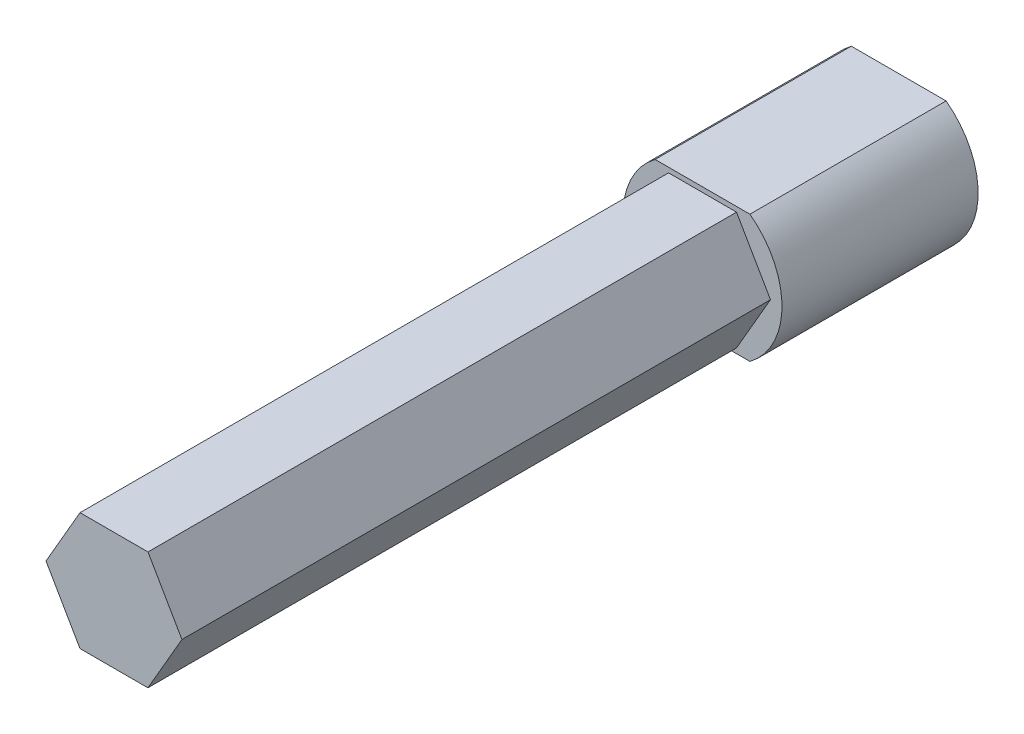
ISO-10303-21;
HEADER;
FILE_DESCRIPTION(('STEP AP214'),'2;1');
FILE_NAME('part.step','',(''),(''),'','','');
FILE_SCHEMA(('AUTOMOTIVE_DESIGN { 1 0 10303 214 1 1 1 1 }'));
ENDSEC;
DATA;
#1=APPLICATION_CONTEXT('core data for automotive mechanical design processes');
#2=APPLICATION_PROTOCOL_DEFINITION('international standard','automotive_design',2000,#1);
#3=PRODUCT_CONTEXT('',#1,'mechanical');
#4=PRODUCT('Part','Part','',(#3));
#5=PRODUCT_RELATED_PRODUCT_CATEGORY('part','',(#4));
#6=PRODUCT_DEFINITION_FORMATION('','',#4);
#7=PRODUCT_DEFINITION_CONTEXT('part definition',#1,'design');
#8=PRODUCT_DEFINITION('design','',#6,#7);
#9=PRODUCT_DEFINITION_SHAPE('','',#8);
#10=(LENGTH_UNIT() NAMED_UNIT(*) SI_UNIT(.MILLI.,.METRE.));
#11=(NAMED_UNIT(*) PLANE_ANGLE_UNIT() SI_UNIT($,.RADIAN.));
#12=(NAMED_UNIT(*) SI_UNIT($,.STERADIAN.) SOLID_ANGLE_UNIT());
#13=UNCERTAINTY_MEASURE_WITH_UNIT(LENGTH_MEASURE(1.E-05),#10,'distance_accuracy_value','');
#14=(GEOMETRIC_REPRESENTATION_CONTEXT(3) GLOBAL_UNCERTAINTY_ASSIGNED_CONTEXT((#13)) GLOBAL_UNIT_ASSIGNED_CONTEXT((#10,
#11,#12)) REPRESENTATION_CONTEXT('',''));
#15=CARTESIAN_POINT('',(0.,0.,0.));
#16=DIRECTION('',(0.,0.,1.));
#17=DIRECTION('',(1.,0.,0.));
#18=AXIS2_PLACEMENT_3D('',#15,#16,#17);
#19=CARTESIAN_POINT('',(0.,0.,10.));
#20=DIRECTION('',(0.,0.,-1.));
#21=DIRECTION('',(-1.,0.,0.));
#22=AXIS2_PLACEMENT_3D('',#19,#20,#21);
#23=CYLINDRICAL_SURFACE('',#22,4.05);
#24=CARTESIAN_POINT('',(0.,0.,0.));
#25=DIRECTION('',(0.,0.,1.));
#26=DIRECTION('',(1.,0.,0.));
#27=AXIS2_PLACEMENT_3D('',#24,#25,#26);
#28=CIRCLE('',#27,4.05);
#29=CARTESIAN_POINT('',(-2.41660919471891,3.25,0.));
#30=VERTEX_POINT('',#29);
#31=CARTESIAN_POINT('',(-2.41660919471891,-3.25,0.));
#32=VERTEX_POINT('',#31);
#33=EDGE_CURVE('E260',#30,#32,#28,.T.);
#34=ORIENTED_EDGE('',*,*,#33,.T.);
#35=DIRECTION('',(0.,0.,-1.));
#36=VECTOR('',#35,1.);
#37=CARTESIAN_POINT('',(-2.41660919471891,-3.25,10.));
#38=LINE('',#37,#36);
#39=CARTESIAN_POINT('',(-2.41660919471891,-3.25,10.));
#40=VERTEX_POINT('',#39);
#41=EDGE_CURVE('E11',#40,#32,#38,.T.);
#42=ORIENTED_EDGE('',*,*,#41,.F.);
#43=CARTESIAN_POINT('',(0.,0.,10.));
#44=DIRECTION('',(0.,0.,1.));
#45=DIRECTION('',(1.,0.,0.));
#46=AXIS2_PLACEMENT_3D('',#43,#44,#45);
#47=CIRCLE('',#46,4.05);
#48=CARTESIAN_POINT('',(-2.41660919471891,3.25,10.));
#49=VERTEX_POINT('',#48);
#50=EDGE_CURVE('E261',#49,#40,#47,.T.);
#51=ORIENTED_EDGE('',*,*,#50,.F.);
#52=DIRECTION('',(0.,0.,-1.));
#53=VECTOR('',#52,1.);
#54=CARTESIAN_POINT('',(-2.41660919471891,3.25,10.));
#55=LINE('',#54,#53);
#56=EDGE_CURVE('E275',#49,#30,#55,.T.);
#57=ORIENTED_EDGE('',*,*,#56,.T.);
#58=EDGE_LOOP('',(#34,#42,#51,#57));
#59=FACE_BOUND('',#58,.T.);
#60=ADVANCED_FACE('F45',(#59),#23,.T.);
#61=CARTESIAN_POINT('',(-2.41660919471891,-3.25,10.));
#62=DIRECTION('',(0.,1.,0.));
#63=DIRECTION('',(0.,0.,1.));
#64=AXIS2_PLACEMENT_3D('',#61,#62,#63);
#65=PLANE('',#64);
#66=DIRECTION('',(1.,0.,0.));
#67=VECTOR('',#66,1.);
#68=CARTESIAN_POINT('',(-2.41660919471891,-3.25,0.));
#69=LINE('',#68,#67);
#70=CARTESIAN_POINT('',(2.41660919471891,-3.25,0.));
#71=VERTEX_POINT('',#70);
#72=EDGE_CURVE('E279',#32,#71,#69,.T.);
#73=ORIENTED_EDGE('',*,*,#72,.T.);
#74=DIRECTION('',(0.,0.,-1.));
#75=VECTOR('',#74,1.);
#76=CARTESIAN_POINT('',(2.41660919471891,-3.25,10.));
#77=LINE('',#76,#75);
#78=CARTESIAN_POINT('',(2.41660919471891,-3.25,10.));
#79=VERTEX_POINT('',#78);
#80=EDGE_CURVE('E53',#79,#71,#77,.T.);
#81=ORIENTED_EDGE('',*,*,#80,.F.);
#82=DIRECTION('',(1.,0.,0.));
#83=VECTOR('',#82,1.);
#84=CARTESIAN_POINT('',(-2.41660919471891,-3.25,10.));
#85=LINE('',#84,#83);
#86=EDGE_CURVE('E265',#40,#79,#85,.T.);
#87=ORIENTED_EDGE('',*,*,#86,.F.);
#88=ORIENTED_EDGE('',*,*,#41,.T.);
#89=EDGE_LOOP('',(#73,#81,#87,#88));
#90=FACE_BOUND('',#89,.T.);
#91=ADVANCED_FACE('F315',(#90),#65,.F.);
#92=CARTESIAN_POINT('',(0.,0.,10.));
#93=DIRECTION('',(0.,0.,-1.));
#94=DIRECTION('',(-1.,0.,0.));
#95=AXIS2_PLACEMENT_3D('',#92,#93,#94);
#96=CYLINDRICAL_SURFACE('',#95,4.05);
#97=CARTESIAN_POINT('',(0.,0.,0.));
#98=DIRECTION('',(0.,0.,1.));
#99=DIRECTION('',(1.,0.,0.));
#100=AXIS2_PLACEMENT_3D('',#97,#98,#99);
#101=CIRCLE('',#100,4.05);
#102=CARTESIAN_POINT('',(2.41660919471891,3.25,0.));
#103=VERTEX_POINT('',#102);
#104=EDGE_CURVE('E282',#71,#103,#101,.T.);
#105=ORIENTED_EDGE('',*,*,#104,.T.);
#106=DIRECTION('',(0.,0.,-1.));
#107=VECTOR('',#106,1.);
#108=CARTESIAN_POINT('',(2.41660919471891,3.25,10.));
#109=LINE('',#108,#107);
#110=CARTESIAN_POINT('',(2.41660919471891,3.25,10.));
#111=VERTEX_POINT('',#110);
#112=EDGE_CURVE('E290',#111,#103,#109,.T.);
#113=ORIENTED_EDGE('',*,*,#112,.F.);
#114=CARTESIAN_POINT('',(0.,0.,10.));
#115=DIRECTION('',(0.,0.,1.));
#116=DIRECTION('',(1.,0.,0.));
#117=AXIS2_PLACEMENT_3D('',#114,#115,#116);
#118=CIRCLE('',#117,4.05);
#119=EDGE_CURVE('E269',#79,#111,#118,.T.);
#120=ORIENTED_EDGE('',*,*,#119,.F.);
#121=ORIENTED_EDGE('',*,*,#80,.T.);
#122=EDGE_LOOP('',(#105,#113,#120,#121));
#123=FACE_BOUND('',#122,.T.);
#124=ADVANCED_FACE('F299',(#123),#96,.T.);
#125=CARTESIAN_POINT('',(-2.41660919471891,3.25,10.));
#126=DIRECTION('',(0.,-1.,0.));
#127=DIRECTION('',(0.,0.,-1.));
#128=AXIS2_PLACEMENT_3D('',#125,#126,#127);
#129=PLANE('',#128);
#130=DIRECTION('',(-1.,0.,0.));
#131=VECTOR('',#130,1.);
#132=CARTESIAN_POINT('',(-2.41660919471891,3.25,0.));
#133=LINE('',#132,#131);
#134=EDGE_CURVE('E266',#103,#30,#133,.T.);
#135=ORIENTED_EDGE('',*,*,#134,.T.);
#136=ORIENTED_EDGE('',*,*,#56,.F.);
#137=DIRECTION('',(-1.,0.,0.));
#138=VECTOR('',#137,1.);
#139=CARTESIAN_POINT('',(-2.41660919471891,3.25,10.));
#140=LINE('',#139,#138);
#141=EDGE_CURVE('E272',#111,#49,#140,.T.);
#142=ORIENTED_EDGE('',*,*,#141,.F.);
#143=ORIENTED_EDGE('',*,*,#112,.T.);
#144=EDGE_LOOP('',(#135,#136,#142,#143));
#145=FACE_BOUND('',#144,.T.);
#146=ADVANCED_FACE('F308',(#145),#129,.F.);
#147=CARTESIAN_POINT('',(0.,0.,10.));
#148=DIRECTION('',(0.,0.,1.));
#149=DIRECTION('',(1.,0.,0.));
#150=AXIS2_PLACEMENT_3D('',#147,#148,#149);
#151=PLANE('',#150);
#152=DIRECTION('',(0.999999819928611,-0.000600118943034689,0.));
#153=VECTOR('',#152,1.);
#154=CARTESIAN_POINT('',(-1.73385085250519,-2.99896002328591,10.));
#155=LINE('',#154,#153);
#156=CARTESIAN_POINT('',(-1.73385085250519,-2.99896002328591,10.));
#157=VERTEX_POINT('',#156);
#158=CARTESIAN_POINT('',(1.73025013884698,-3.00103889628575,10.));
#159=VERTEX_POINT('',#158);
#160=EDGE_CURVE('E68',#157,#159,#155,.T.);
#161=ORIENTED_EDGE('',*,*,#160,.F.);
#162=DIRECTION('',(0.499480191714345,-0.866325307309559,0.));
#163=VECTOR('',#162,1.);
#164=CARTESIAN_POINT('',(-3.46410099135217,0.00207887299984251,10.));
#165=LINE('',#164,#163);
#166=CARTESIAN_POINT('',(-3.46410099135217,0.00207887299984251,10.));
#167=VERTEX_POINT('',#166);
#168=EDGE_CURVE('E201',#167,#157,#165,.T.);
#169=ORIENTED_EDGE('',*,*,#168,.F.);
#170=DIRECTION('',(-0.500519628214266,-0.865725188366524,0.));
#171=VECTOR('',#170,1.);
#172=CARTESIAN_POINT('',(-1.73025013884698,3.00103889628575,10.));
#173=LINE('',#172,#171);
#174=CARTESIAN_POINT('',(-1.73025013884698,3.00103889628575,10.));
#175=VERTEX_POINT('',#174);
#176=EDGE_CURVE('E231',#175,#167,#173,.T.);
#177=ORIENTED_EDGE('',*,*,#176,.F.);
#178=DIRECTION('',(-0.999999819928611,0.000600118943034564,0.));
#179=VECTOR('',#178,1.);
#180=CARTESIAN_POINT('',(1.73385085250519,2.99896002328591,10.));
#181=LINE('',#180,#179);
#182=CARTESIAN_POINT('',(1.73385085250519,2.99896002328591,10.));
#183=VERTEX_POINT('',#182);
#184=EDGE_CURVE('E227',#183,#175,#181,.T.);
#185=ORIENTED_EDGE('',*,*,#184,.F.);
#186=DIRECTION('',(-0.499480191714345,0.866325307309558,0.));
#187=VECTOR('',#186,1.);
#188=CARTESIAN_POINT('',(3.46410099135216,-0.00207887299984231,10.));
#189=LINE('',#188,#187);
#190=CARTESIAN_POINT('',(3.46410099135216,-0.00207887299984231,10.));
#191=VERTEX_POINT('',#190);
#192=EDGE_CURVE('E223',#191,#183,#189,.T.);
#193=ORIENTED_EDGE('',*,*,#192,.F.);
#194=DIRECTION('',(0.500519628214266,0.865725188366524,0.));
#195=VECTOR('',#194,1.);
#196=CARTESIAN_POINT('',(1.73025013884698,-3.00103889628575,10.));
#197=LINE('',#196,#195);
#198=EDGE_CURVE('E219',#159,#191,#197,.T.);
#199=ORIENTED_EDGE('',*,*,#198,.F.);
#200=EDGE_LOOP('',(#161,#169,#177,#185,#193,#199));
#201=FACE_BOUND('',#200,.T.);
#202=ORIENTED_EDGE('',*,*,#50,.T.);
#203=ORIENTED_EDGE('',*,*,#86,.T.);
#204=ORIENTED_EDGE('',*,*,#119,.T.);
#205=ORIENTED_EDGE('',*,*,#141,.T.);
#206=EDGE_LOOP('',(#202,#203,#204,#205));
#207=FACE_BOUND('',#206,.T.);
#208=ADVANCED_FACE('F314',(#201,#207),#151,.T.);
#209=CARTESIAN_POINT('',(0.,0.,0.));
#210=DIRECTION('',(0.,0.,1.));
#211=DIRECTION('',(1.,0.,0.));
#212=AXIS2_PLACEMENT_3D('',#209,#210,#211);
#213=PLANE('',#212);
#214=DIRECTION('',(1.,0.,0.));
#215=VECTOR('',#214,1.);
#216=CARTESIAN_POINT('',(-2.19089023002066,2.6,0.));
#217=LINE('',#216,#215);
#218=CARTESIAN_POINT('',(-2.19089023002066,2.6,0.));
#219=VERTEX_POINT('',#218);
#220=CARTESIAN_POINT('',(2.19089023002067,2.6,0.));
#221=VERTEX_POINT('',#220);
#222=EDGE_CURVE('E182',#219,#221,#217,.T.);
#223=ORIENTED_EDGE('',*,*,#222,.F.);
#224=CARTESIAN_POINT('',(0.,0.,0.));
#225=DIRECTION('',(0.,0.,-1.));
#226=DIRECTION('',(-1.,0.,0.));
#227=AXIS2_PLACEMENT_3D('',#224,#225,#226);
#228=CIRCLE('',#227,3.4);
#229=CARTESIAN_POINT('',(-2.19089023002066,-2.6,0.));
#230=VERTEX_POINT('',#229);
#231=EDGE_CURVE('E60',#230,#219,#228,.T.);
#232=ORIENTED_EDGE('',*,*,#231,.F.);
#233=DIRECTION('',(-1.,0.,0.));
#234=VECTOR('',#233,1.);
#235=CARTESIAN_POINT('',(2.19089023002066,-2.6,0.));
#236=LINE('',#235,#234);
#237=CARTESIAN_POINT('',(2.19089023002066,-2.6,0.));
#238=VERTEX_POINT('',#237);
#239=EDGE_CURVE('E169',#238,#230,#236,.T.);
#240=ORIENTED_EDGE('',*,*,#239,.F.);
#241=CARTESIAN_POINT('',(0.,0.,0.));
#242=DIRECTION('',(0.,0.,-1.));
#243=DIRECTION('',(-1.,0.,0.));
#244=AXIS2_PLACEMENT_3D('',#241,#242,#243);
#245=CIRCLE('',#244,3.4);
#246=EDGE_CURVE('E173',#221,#238,#245,.T.);
#247=ORIENTED_EDGE('',*,*,#246,.F.);
#248=EDGE_LOOP('',(#223,#232,#240,#247));
#249=FACE_BOUND('',#248,.T.);
#250=ORIENTED_EDGE('',*,*,#33,.F.);
#251=ORIENTED_EDGE('',*,*,#134,.F.);
#252=ORIENTED_EDGE('',*,*,#104,.F.);
#253=ORIENTED_EDGE('',*,*,#72,.F.);
#254=EDGE_LOOP('',(#250,#251,#252,#253));
#255=FACE_BOUND('',#254,.T.);
#256=ADVANCED_FACE('F305',(#249,#255),#213,.F.);
#257=CARTESIAN_POINT('',(-1.73385085250519,-2.99896002328591,40.));
#258=DIRECTION('',(0.000600118943034689,0.999999819928611,0.));
#259=DIRECTION('',(-0.999999819928611,0.000600118943034689,0.));
#260=AXIS2_PLACEMENT_3D('',#257,#258,#259);
#261=PLANE('',#260);
#262=ORIENTED_EDGE('',*,*,#160,.T.);
#263=DIRECTION('',(0.,0.,-1.));
#264=VECTOR('',#263,1.);
#265=CARTESIAN_POINT('',(1.73025013884698,-3.00103889628575,40.));
#266=LINE('',#265,#264);
#267=CARTESIAN_POINT('',(1.73025013884698,-3.00103889628575,40.));
#268=VERTEX_POINT('',#267);
#269=EDGE_CURVE('E256',#268,#159,#266,.T.);
#270=ORIENTED_EDGE('',*,*,#269,.F.);
#271=DIRECTION('',(0.999999819928611,-0.000600118943034689,0.));
#272=VECTOR('',#271,1.);
#273=CARTESIAN_POINT('',(-1.73385085250519,-2.99896002328591,40.));
#274=LINE('',#273,#272);
#275=CARTESIAN_POINT('',(-1.73385085250519,-2.99896002328591,40.));
#276=VERTEX_POINT('',#275);
#277=EDGE_CURVE('E196',#276,#268,#274,.T.);
#278=ORIENTED_EDGE('',*,*,#277,.F.);
#279=DIRECTION('',(0.,0.,-1.));
#280=VECTOR('',#279,1.);
#281=CARTESIAN_POINT('',(-1.73385085250519,-2.99896002328591,40.));
#282=LINE('',#281,#280);
#283=EDGE_CURVE('E216',#276,#157,#282,.T.);
#284=ORIENTED_EDGE('',*,*,#283,.T.);
#285=EDGE_LOOP('',(#262,#270,#278,#284));
#286=FACE_BOUND('',#285,.T.);
#287=ADVANCED_FACE('F327',(#286),#261,.F.);
#288=CARTESIAN_POINT('',(1.73025013884698,-3.00103889628575,40.));
#289=DIRECTION('',(-0.865725188366524,0.500519628214266,0.));
#290=DIRECTION('',(-0.500519628214266,-0.865725188366524,0.));
#291=AXIS2_PLACEMENT_3D('',#288,#289,#290);
#292=PLANE('',#291);
#293=ORIENTED_EDGE('',*,*,#198,.T.);
#294=DIRECTION('',(0.,0.,-1.));
#295=VECTOR('',#294,1.);
#296=CARTESIAN_POINT('',(3.46410099135216,-0.00207887299984231,40.));
#297=LINE('',#296,#295);
#298=CARTESIAN_POINT('',(3.46410099135216,-0.00207887299984231,40.));
#299=VERTEX_POINT('',#298);
#300=EDGE_CURVE('E252',#299,#191,#297,.T.);
#301=ORIENTED_EDGE('',*,*,#300,.F.);
#302=DIRECTION('',(0.500519628214266,0.865725188366524,0.));
#303=VECTOR('',#302,1.);
#304=CARTESIAN_POINT('',(1.73025013884698,-3.00103889628575,40.));
#305=LINE('',#304,#303);
#306=EDGE_CURVE('E200',#268,#299,#305,.T.);
#307=ORIENTED_EDGE('',*,*,#306,.F.);
#308=ORIENTED_EDGE('',*,*,#269,.T.);
#309=EDGE_LOOP('',(#293,#301,#307,#308));
#310=FACE_BOUND('',#309,.T.);
#311=ADVANCED_FACE('F333',(#310),#292,.F.);
#312=CARTESIAN_POINT('',(3.46410099135216,-0.00207887299984231,40.));
#313=DIRECTION('',(-0.866325307309558,-0.499480191714345,0.));
#314=DIRECTION('',(0.499480191714345,-0.866325307309558,0.));
#315=AXIS2_PLACEMENT_3D('',#312,#313,#314);
#316=PLANE('',#315);
#317=ORIENTED_EDGE('',*,*,#192,.T.);
#318=DIRECTION('',(0.,0.,-1.));
#319=VECTOR('',#318,1.);
#320=CARTESIAN_POINT('',(1.73385085250519,2.99896002328591,40.));
#321=LINE('',#320,#319);
#322=CARTESIAN_POINT('',(1.73385085250519,2.99896002328591,40.));
#323=VERTEX_POINT('',#322);
#324=EDGE_CURVE('E248',#323,#183,#321,.T.);
#325=ORIENTED_EDGE('',*,*,#324,.F.);
#326=DIRECTION('',(-0.499480191714345,0.866325307309558,0.));
#327=VECTOR('',#326,1.);
#328=CARTESIAN_POINT('',(3.46410099135216,-0.00207887299984231,40.));
#329=LINE('',#328,#327);
#330=EDGE_CURVE('E204',#299,#323,#329,.T.);
#331=ORIENTED_EDGE('',*,*,#330,.F.);
#332=ORIENTED_EDGE('',*,*,#300,.T.);
#333=EDGE_LOOP('',(#317,#325,#331,#332));
#334=FACE_BOUND('',#333,.T.);
#335=ADVANCED_FACE('F337',(#334),#316,.F.);
#336=CARTESIAN_POINT('',(1.73385085250519,2.99896002328591,40.));
#337=DIRECTION('',(-0.000600118943034564,-0.999999819928611,0.));
#338=DIRECTION('',(0.999999819928611,-0.000600118943034564,0.));
#339=AXIS2_PLACEMENT_3D('',#336,#337,#338);
#340=PLANE('',#339);
#341=ORIENTED_EDGE('',*,*,#184,.T.);
#342=DIRECTION('',(0.,0.,-1.));
#343=VECTOR('',#342,1.);
#344=CARTESIAN_POINT('',(-1.73025013884698,3.00103889628575,40.));
#345=LINE('',#344,#343);
#346=CARTESIAN_POINT('',(-1.73025013884698,3.00103889628575,40.));
#347=VERTEX_POINT('',#346);
#348=EDGE_CURVE('E244',#347,#175,#345,.T.);
#349=ORIENTED_EDGE('',*,*,#348,.F.);
#350=DIRECTION('',(-0.999999819928611,0.000600118943034564,0.));
#351=VECTOR('',#350,1.);
#352=CARTESIAN_POINT('',(1.73385085250519,2.99896002328591,40.));
#353=LINE('',#352,#351);
#354=EDGE_CURVE('E207',#323,#347,#353,.T.);
#355=ORIENTED_EDGE('',*,*,#354,.F.);
#356=ORIENTED_EDGE('',*,*,#324,.T.);
#357=EDGE_LOOP('',(#341,#349,#355,#356));
#358=FACE_BOUND('',#357,.T.);
#359=ADVANCED_FACE('F341',(#358),#340,.F.);
#360=CARTESIAN_POINT('',(-1.73025013884698,3.00103889628575,40.));
#361=DIRECTION('',(0.865725188366524,-0.500519628214266,0.));
#362=DIRECTION('',(0.500519628214266,0.865725188366524,0.));
#363=AXIS2_PLACEMENT_3D('',#360,#361,#362);
#364=PLANE('',#363);
#365=ORIENTED_EDGE('',*,*,#176,.T.);
#366=DIRECTION('',(0.,0.,-1.));
#367=VECTOR('',#366,1.);
#368=CARTESIAN_POINT('',(-3.46410099135217,0.00207887299984251,40.));
#369=LINE('',#368,#367);
#370=CARTESIAN_POINT('',(-3.46410099135217,0.00207887299984251,40.));
#371=VERTEX_POINT('',#370);
#372=EDGE_CURVE('E240',#371,#167,#369,.T.);
#373=ORIENTED_EDGE('',*,*,#372,.F.);
#374=DIRECTION('',(-0.500519628214266,-0.865725188366524,0.));
#375=VECTOR('',#374,1.);
#376=CARTESIAN_POINT('',(-1.73025013884698,3.00103889628575,40.));
#377=LINE('',#376,#375);
#378=EDGE_CURVE('E210',#347,#371,#377,.T.);
#379=ORIENTED_EDGE('',*,*,#378,.F.);
#380=ORIENTED_EDGE('',*,*,#348,.T.);
#381=EDGE_LOOP('',(#365,#373,#379,#380));
#382=FACE_BOUND('',#381,.T.);
#383=ADVANCED_FACE('F345',(#382),#364,.F.);
#384=CARTESIAN_POINT('',(-3.46410099135217,0.00207887299984251,40.));
#385=DIRECTION('',(0.866325307309559,0.499480191714345,0.));
#386=DIRECTION('',(-0.499480191714345,0.866325307309559,0.));
#387=AXIS2_PLACEMENT_3D('',#384,#385,#386);
#388=PLANE('',#387);
#389=ORIENTED_EDGE('',*,*,#168,.T.);
#390=ORIENTED_EDGE('',*,*,#283,.F.);
#391=DIRECTION('',(0.499480191714345,-0.866325307309559,0.));
#392=VECTOR('',#391,1.);
#393=CARTESIAN_POINT('',(-3.46410099135217,0.00207887299984251,40.));
#394=LINE('',#393,#392);
#395=EDGE_CURVE('E213',#371,#276,#394,.T.);
#396=ORIENTED_EDGE('',*,*,#395,.F.);
#397=ORIENTED_EDGE('',*,*,#372,.T.);
#398=EDGE_LOOP('',(#389,#390,#396,#397));
#399=FACE_BOUND('',#398,.T.);
#400=ADVANCED_FACE('F349',(#399),#388,.F.);
#401=CARTESIAN_POINT('',(0.,0.,40.));
#402=DIRECTION('',(0.,0.,1.));
#403=DIRECTION('',(1.,0.,0.));
#404=AXIS2_PLACEMENT_3D('',#401,#402,#403);
#405=PLANE('',#404);
#406=ORIENTED_EDGE('',*,*,#277,.T.);
#407=ORIENTED_EDGE('',*,*,#306,.T.);
#408=ORIENTED_EDGE('',*,*,#330,.T.);
#409=ORIENTED_EDGE('',*,*,#354,.T.);
#410=ORIENTED_EDGE('',*,*,#378,.T.);
#411=ORIENTED_EDGE('',*,*,#395,.T.);
#412=EDGE_LOOP('',(#406,#407,#408,#409,#410,#411));
#413=FACE_BOUND('',#412,.T.);
#414=ADVANCED_FACE('F353',(#413),#405,.T.);
#415=CARTESIAN_POINT('',(0.,0.,5.));
#416=DIRECTION('',(0.,0.,-1.));
#417=DIRECTION('',(-1.,0.,0.));
#418=AXIS2_PLACEMENT_3D('',#415,#416,#417);
#419=CYLINDRICAL_SURFACE('',#418,3.4);
#420=ORIENTED_EDGE('',*,*,#231,.T.);
#421=DIRECTION('',(0.,0.,-1.));
#422=VECTOR('',#421,1.);
#423=CARTESIAN_POINT('',(-2.19089023002066,2.6,5.));
#424=LINE('',#423,#422);
#425=CARTESIAN_POINT('',(-2.19089023002066,2.6,5.));
#426=VERTEX_POINT('',#425);
#427=EDGE_CURVE('E144',#426,#219,#424,.T.);
#428=ORIENTED_EDGE('',*,*,#427,.F.);
#429=CARTESIAN_POINT('',(0.,0.,5.));
#430=DIRECTION('',(0.,0.,-1.));
#431=DIRECTION('',(-1.,0.,0.));
#432=AXIS2_PLACEMENT_3D('',#429,#430,#431);
#433=CIRCLE('',#432,3.4);
#434=CARTESIAN_POINT('',(-2.19089023002066,-2.6,5.));
#435=VERTEX_POINT('',#434);
#436=EDGE_CURVE('E148',#435,#426,#433,.T.);
#437=ORIENTED_EDGE('',*,*,#436,.F.);
#438=DIRECTION('',(0.,0.,-1.));
#439=VECTOR('',#438,1.);
#440=CARTESIAN_POINT('',(-2.19089023002066,-2.6,5.));
#441=LINE('',#440,#439);
#442=EDGE_CURVE('E188',#435,#230,#441,.T.);
#443=ORIENTED_EDGE('',*,*,#442,.T.);
#444=EDGE_LOOP('',(#420,#428,#437,#443));
#445=FACE_BOUND('',#444,.T.);
#446=ADVANCED_FACE('F146',(#445),#419,.F.);
#447=CARTESIAN_POINT('',(2.19089023002066,-2.6,5.));
#448=DIRECTION('',(0.,-1.,0.));
#449=DIRECTION('',(0.,0.,-1.));
#450=AXIS2_PLACEMENT_3D('',#447,#448,#449);
#451=PLANE('',#450);
#452=ORIENTED_EDGE('',*,*,#239,.T.);
#453=ORIENTED_EDGE('',*,*,#442,.F.);
#454=DIRECTION('',(-1.,0.,0.));
#455=VECTOR('',#454,1.);
#456=CARTESIAN_POINT('',(2.19089023002066,-2.6,5.));
#457=LINE('',#456,#455);
#458=CARTESIAN_POINT('',(2.19089023002066,-2.6,5.));
#459=VERTEX_POINT('',#458);
#460=EDGE_CURVE('E155',#459,#435,#457,.T.);
#461=ORIENTED_EDGE('',*,*,#460,.F.);
#462=DIRECTION('',(0.,0.,-1.));
#463=VECTOR('',#462,1.);
#464=CARTESIAN_POINT('',(2.19089023002066,-2.6,5.));
#465=LINE('',#464,#463);
#466=EDGE_CURVE('E191',#459,#238,#465,.T.);
#467=ORIENTED_EDGE('',*,*,#466,.T.);
#468=EDGE_LOOP('',(#452,#453,#461,#467));
#469=FACE_BOUND('',#468,.T.);
#470=ADVANCED_FACE('F360',(#469),#451,.F.);
#471=CARTESIAN_POINT('',(0.,0.,5.));
#472=DIRECTION('',(0.,0.,-1.));
#473=DIRECTION('',(-1.,0.,0.));
#474=AXIS2_PLACEMENT_3D('',#471,#472,#473);
#475=CYLINDRICAL_SURFACE('',#474,3.4);
#476=ORIENTED_EDGE('',*,*,#246,.T.);
#477=ORIENTED_EDGE('',*,*,#466,.F.);
#478=CARTESIAN_POINT('',(0.,0.,5.));
#479=DIRECTION('',(0.,0.,-1.));
#480=DIRECTION('',(-1.,0.,0.));
#481=AXIS2_PLACEMENT_3D('',#478,#479,#480);
#482=CIRCLE('',#481,3.4);
#483=CARTESIAN_POINT('',(2.19089023002067,2.6,5.));
#484=VERTEX_POINT('',#483);
#485=EDGE_CURVE('E164',#484,#459,#482,.T.);
#486=ORIENTED_EDGE('',*,*,#485,.F.);
#487=DIRECTION('',(0.,0.,-1.));
#488=VECTOR('',#487,1.);
#489=CARTESIAN_POINT('',(2.19089023002067,2.6,5.));
#490=LINE('',#489,#488);
#491=EDGE_CURVE('E154',#484,#221,#490,.T.);
#492=ORIENTED_EDGE('',*,*,#491,.T.);
#493=EDGE_LOOP('',(#476,#477,#486,#492));
#494=FACE_BOUND('',#493,.T.);
#495=ADVANCED_FACE('F363',(#494),#475,.F.);
#496=CARTESIAN_POINT('',(-2.19089023002066,2.6,5.));
#497=DIRECTION('',(0.,1.,0.));
#498=DIRECTION('',(-1.,0.,0.));
#499=AXIS2_PLACEMENT_3D('',#496,#497,#498);
#500=PLANE('',#499);
#501=ORIENTED_EDGE('',*,*,#222,.T.);
#502=ORIENTED_EDGE('',*,*,#491,.F.);
#503=DIRECTION('',(1.,0.,0.));
#504=VECTOR('',#503,1.);
#505=CARTESIAN_POINT('',(-2.19089023002066,2.6,5.));
#506=LINE('',#505,#504);
#507=EDGE_CURVE('E158',#426,#484,#506,.T.);
#508=ORIENTED_EDGE('',*,*,#507,.F.);
#509=ORIENTED_EDGE('',*,*,#427,.T.);
#510=EDGE_LOOP('',(#501,#502,#508,#509));
#511=FACE_BOUND('',#510,.T.);
#512=ADVANCED_FACE('F159',(#511),#500,.F.);
#513=CARTESIAN_POINT('',(0.,0.,5.));
#514=DIRECTION('',(0.,0.,-1.));
#515=DIRECTION('',(-1.,0.,0.));
#516=AXIS2_PLACEMENT_3D('',#513,#514,#515);
#517=PLANE('',#516);
#518=ORIENTED_EDGE('',*,*,#436,.T.);
#519=ORIENTED_EDGE('',*,*,#507,.T.);
#520=ORIENTED_EDGE('',*,*,#485,.T.);
#521=ORIENTED_EDGE('',*,*,#460,.T.);
#522=EDGE_LOOP('',(#518,#519,#520,#521));
#523=FACE_BOUND('',#522,.T.);
#524=ADVANCED_FACE('F166',(#523),#517,.T.);
#525=CLOSED_SHELL('',(#60,#91,#124,#146,#208,#256,#287,#311,#335,#359,#383,#400,#414,#446,#470,
#495,#512,#524));
#526=MANIFOLD_SOLID_BREP('B2',#525);
#527=ADVANCED_BREP_SHAPE_REPRESENTATION('',(#18,#526),#14);
#528=SHAPE_DEFINITION_REPRESENTATION(#9,#527);
ENDSEC;
END-ISO-10303-21;
